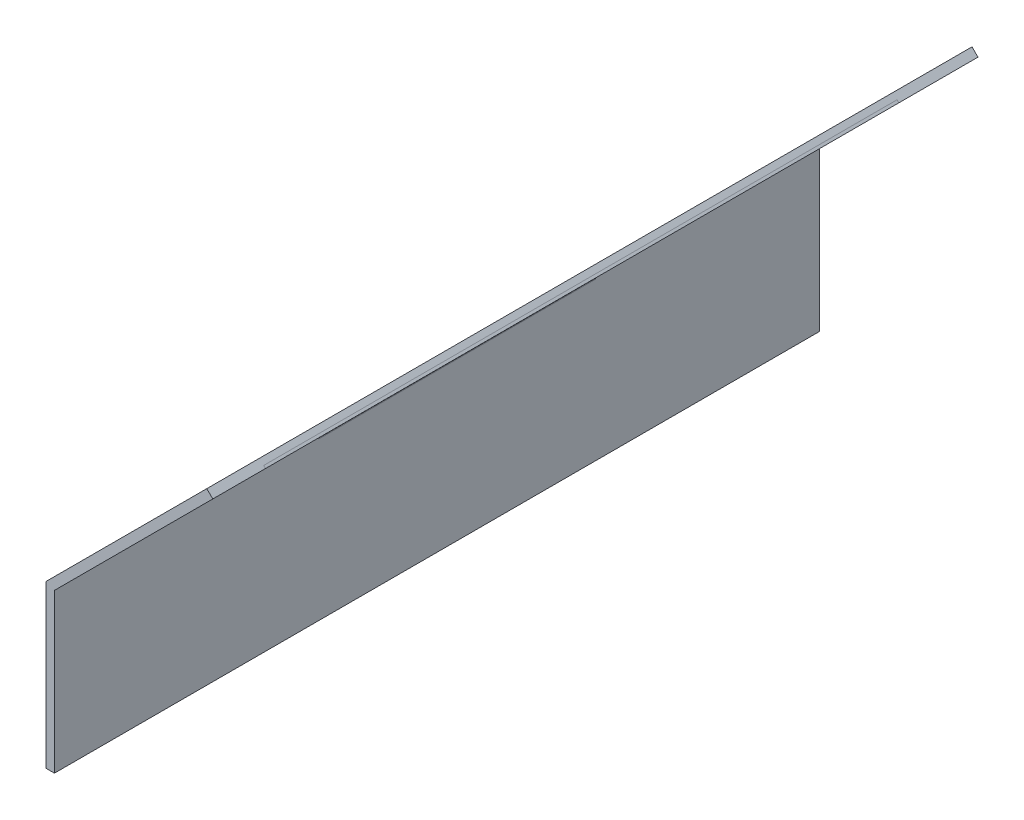
ISO-10303-21;
HEADER;
FILE_DESCRIPTION(('STEP AP214'),'2;1');
FILE_NAME('part.step','',(''),(''),'','','');
FILE_SCHEMA(('AUTOMOTIVE_DESIGN { 1 0 10303 214 1 1 1 1 }'));
ENDSEC;
DATA;
#1=APPLICATION_CONTEXT('core data for automotive mechanical design processes');
#2=APPLICATION_PROTOCOL_DEFINITION('international standard','automotive_design',2000,#1);
#3=PRODUCT_CONTEXT('',#1,'mechanical');
#4=PRODUCT('Part','Part','',(#3));
#5=PRODUCT_RELATED_PRODUCT_CATEGORY('part','',(#4));
#6=PRODUCT_DEFINITION_FORMATION('','',#4);
#7=PRODUCT_DEFINITION_CONTEXT('part definition',#1,'design');
#8=PRODUCT_DEFINITION('design','',#6,#7);
#9=PRODUCT_DEFINITION_SHAPE('','',#8);
#10=(LENGTH_UNIT() NAMED_UNIT(*) SI_UNIT(.MILLI.,.METRE.));
#11=(NAMED_UNIT(*) PLANE_ANGLE_UNIT() SI_UNIT($,.RADIAN.));
#12=(NAMED_UNIT(*) SI_UNIT($,.STERADIAN.) SOLID_ANGLE_UNIT());
#13=UNCERTAINTY_MEASURE_WITH_UNIT(LENGTH_MEASURE(1.E-05),#10,'distance_accuracy_value','');
#14=(GEOMETRIC_REPRESENTATION_CONTEXT(3) GLOBAL_UNCERTAINTY_ASSIGNED_CONTEXT((#13)) GLOBAL_UNIT_ASSIGNED_CONTEXT((#10,
#11,#12)) REPRESENTATION_CONTEXT('',''));
#15=CARTESIAN_POINT('',(0.,0.,0.));
#16=DIRECTION('',(0.,0.,1.));
#17=DIRECTION('',(1.,0.,0.));
#18=AXIS2_PLACEMENT_3D('',#15,#16,#17);
#19=CARTESIAN_POINT('',(5.334,75.6739487757862,-368.3));
#20=DIRECTION('',(0.,0.,-1.));
#21=DIRECTION('',(-1.,0.,0.));
#22=AXIS2_PLACEMENT_3D('',#19,#20,#21);
#23=CYLINDRICAL_SURFACE('',#22,2.48412);
#24=CARTESIAN_POINT('',(5.334,75.6739487757862,-25.3999999999999));
#25=DIRECTION('',(0.,0.,-1.));
#26=DIRECTION('',(0.,1.,0.));
#27=AXIS2_PLACEMENT_3D('',#24,#25,#26);
#28=CIRCLE('',#27,2.48412);
#29=CARTESIAN_POINT('',(3.57746190271888,77.4304868730673,-25.3999999999999));
#30=VERTEX_POINT('',#29);
#31=CARTESIAN_POINT('',(3.01788208970269,76.5719743878931,-25.3999999999999));
#32=VERTEX_POINT('',#31);
#33=EDGE_CURVE('E70',#30,#32,#28,.F.);
#34=ORIENTED_EDGE('',*,*,#33,.F.);
#35=DIRECTION('',(0.,0.,1.));
#36=VECTOR('',#35,1.);
#37=CARTESIAN_POINT('',(3.57746190271889,77.4304868730673,-368.3));
#38=LINE('',#37,#36);
#39=CARTESIAN_POINT('',(3.57746190271889,77.4304868730673,-330.2));
#40=VERTEX_POINT('',#39);
#41=EDGE_CURVE('E77',#30,#40,#38,.F.);
#42=ORIENTED_EDGE('',*,*,#41,.T.);
#43=CARTESIAN_POINT('',(5.334,75.6739487757862,-330.2));
#44=DIRECTION('',(0.,0.,1.));
#45=DIRECTION('',(1.,0.,0.));
#46=AXIS2_PLACEMENT_3D('',#43,#44,#45);
#47=CIRCLE('',#46,2.48412);
#48=CARTESIAN_POINT('',(3.01788208970269,76.5719743878931,-330.2));
#49=VERTEX_POINT('',#48);
#50=EDGE_CURVE('E189',#49,#40,#47,.F.);
#51=ORIENTED_EDGE('',*,*,#50,.F.);
#52=DIRECTION('',(0.,0.,-1.));
#53=VECTOR('',#52,1.);
#54=CARTESIAN_POINT('',(3.01788208970269,76.5719743878931,-368.3));
#55=LINE('',#54,#53);
#56=CARTESIAN_POINT('',(3.01788208970269,76.5719743878931,-260.35));
#57=VERTEX_POINT('',#56);
#58=EDGE_CURVE('E235',#57,#49,#55,.T.);
#59=ORIENTED_EDGE('',*,*,#58,.F.);
#60=CARTESIAN_POINT('',(5.334,75.6739487757862,-260.35));
#61=DIRECTION('',(0.,0.,1.));
#62=DIRECTION('',(1.,0.,0.));
#63=AXIS2_PLACEMENT_3D('',#60,#61,#62);
#64=CIRCLE('',#63,2.48412);
#65=CARTESIAN_POINT('',(2.84988,75.6739487757861,-260.35));
#66=VERTEX_POINT('',#65);
#67=EDGE_CURVE('E222',#66,#57,#64,.F.);
#68=ORIENTED_EDGE('',*,*,#67,.F.);
#69=DIRECTION('',(0.,0.,1.));
#70=VECTOR('',#69,1.);
#71=CARTESIAN_POINT('',(2.84988,75.6739487757861,-368.3));
#72=LINE('',#71,#70);
#73=CARTESIAN_POINT('',(2.84988,75.6739487757862,-127.));
#74=VERTEX_POINT('',#73);
#75=EDGE_CURVE('E161',#66,#74,#72,.T.);
#76=ORIENTED_EDGE('',*,*,#75,.T.);
#77=CARTESIAN_POINT('',(5.334,75.6739487757862,-127.));
#78=DIRECTION('',(0.,0.,-1.));
#79=DIRECTION('',(-1.,0.,0.));
#80=AXIS2_PLACEMENT_3D('',#77,#78,#79);
#81=CIRCLE('',#80,2.48412);
#82=CARTESIAN_POINT('',(3.01788208970269,76.5719743878931,-127.));
#83=VERTEX_POINT('',#82);
#84=EDGE_CURVE('E171',#83,#74,#81,.F.);
#85=ORIENTED_EDGE('',*,*,#84,.F.);
#86=DIRECTION('',(0.,0.,-1.));
#87=VECTOR('',#86,1.);
#88=CARTESIAN_POINT('',(3.01788208970269,76.5719743878931,-368.3));
#89=LINE('',#88,#87);
#90=EDGE_CURVE('E175',#83,#32,#89,.F.);
#91=ORIENTED_EDGE('',*,*,#90,.T.);
#92=EDGE_LOOP('',(#34,#42,#51,#59,#68,#76,#85,#91));
#93=FACE_BOUND('',#92,.T.);
#94=ADVANCED_FACE('F55',(#93),#23,.T.);
#95=CARTESIAN_POINT('',(4.06400000000001,0.,-368.3));
#96=DIRECTION('',(0.,1.,0.));
#97=DIRECTION('',(0.,0.,1.));
#98=AXIS2_PLACEMENT_3D('',#95,#96,#97);
#99=PLANE('',#98);
#100=DIRECTION('',(1.,0.,0.));
#101=VECTOR('',#100,1.);
#102=CARTESIAN_POINT('',(-139.7,0.,-260.35));
#103=LINE('',#102,#101);
#104=CARTESIAN_POINT('',(2.84988000000001,0.,-260.35));
#105=VERTEX_POINT('',#104);
#106=CARTESIAN_POINT('',(4.06400000000001,0.,-260.35));
#107=VERTEX_POINT('',#106);
#108=EDGE_CURVE('E218',#105,#107,#103,.T.);
#109=ORIENTED_EDGE('',*,*,#108,.T.);
#110=DIRECTION('',(0.,0.,1.));
#111=VECTOR('',#110,1.);
#112=CARTESIAN_POINT('',(4.06400000000001,0.,-368.3));
#113=LINE('',#112,#111);
#114=CARTESIAN_POINT('',(4.06400000000001,0.,-127.));
#115=VERTEX_POINT('',#114);
#116=EDGE_CURVE('E257',#107,#115,#113,.T.);
#117=ORIENTED_EDGE('',*,*,#116,.T.);
#118=DIRECTION('',(1.,0.,0.));
#119=VECTOR('',#118,1.);
#120=CARTESIAN_POINT('',(-139.7,0.,-127.));
#121=LINE('',#120,#119);
#122=CARTESIAN_POINT('',(2.84988,0.,-127.));
#123=VERTEX_POINT('',#122);
#124=EDGE_CURVE('E238',#123,#115,#121,.T.);
#125=ORIENTED_EDGE('',*,*,#124,.F.);
#126=DIRECTION('',(0.,0.,1.));
#127=VECTOR('',#126,1.);
#128=CARTESIAN_POINT('',(2.84988000000001,0.,-368.3));
#129=LINE('',#128,#127);
#130=EDGE_CURVE('E162',#105,#123,#129,.T.);
#131=ORIENTED_EDGE('',*,*,#130,.F.);
#132=EDGE_LOOP('',(#109,#117,#125,#131));
#133=FACE_BOUND('',#132,.T.);
#134=ADVANCED_FACE('F57',(#133),#99,.F.);
#135=CARTESIAN_POINT('',(80.2640000000003,152.4,-368.3));
#136=DIRECTION('',(0.707106781186549,0.707106781186546,0.));
#137=DIRECTION('',(0.,0.,1.));
#138=AXIS2_PLACEMENT_3D('',#135,#136,#137);
#139=PLANE('',#138);
#140=DIRECTION('',(-0.707106781186546,0.707106781186549,0.));
#141=VECTOR('',#140,1.);
#142=CARTESIAN_POINT('',(80.2640000000003,152.4,-25.3999999999999));
#143=LINE('',#142,#141);
#144=CARTESIAN_POINT('',(80.2640000000003,152.4,-25.3999999999999));
#145=VERTEX_POINT('',#144);
#146=CARTESIAN_POINT('',(79.4054875148261,153.258512485174,-25.3999999999999));
#147=VERTEX_POINT('',#146);
#148=EDGE_CURVE('E137',#145,#147,#143,.T.);
#149=ORIENTED_EDGE('',*,*,#148,.F.);
#150=DIRECTION('',(0.,0.,1.));
#151=VECTOR('',#150,1.);
#152=CARTESIAN_POINT('',(80.2640000000003,152.4,-368.3));
#153=LINE('',#152,#151);
#154=CARTESIAN_POINT('',(80.2640000000003,152.4,-330.2));
#155=VERTEX_POINT('',#154);
#156=EDGE_CURVE('E260',#155,#145,#153,.T.);
#157=ORIENTED_EDGE('',*,*,#156,.F.);
#158=DIRECTION('',(0.707106781186546,-0.707106781186549,0.));
#159=VECTOR('',#158,1.);
#160=CARTESIAN_POINT('',(80.2640000000003,152.4,-330.2));
#161=LINE('',#160,#159);
#162=CARTESIAN_POINT('',(79.4054875148261,153.258512485174,-330.2));
#163=VERTEX_POINT('',#162);
#164=EDGE_CURVE('E159',#163,#155,#161,.T.);
#165=ORIENTED_EDGE('',*,*,#164,.F.);
#166=DIRECTION('',(0.,0.,1.));
#167=VECTOR('',#166,1.);
#168=CARTESIAN_POINT('',(79.4054875148261,153.258512485174,-368.3));
#169=LINE('',#168,#167);
#170=EDGE_CURVE('E153',#163,#147,#169,.T.);
#171=ORIENTED_EDGE('',*,*,#170,.T.);
#172=EDGE_LOOP('',(#149,#157,#165,#171));
#173=FACE_BOUND('',#172,.T.);
#174=ADVANCED_FACE('F158',(#173),#139,.T.);
#175=CARTESIAN_POINT('',(4.064,76.2,-368.3));
#176=DIRECTION('',(0.707106781186546,-0.707106781186549,0.));
#177=DIRECTION('',(0.707106781186549,0.707106781186546,0.));
#178=AXIS2_PLACEMENT_3D('',#175,#176,#177);
#179=PLANE('',#178);
#180=DIRECTION('',(0.707106781186549,0.707106781186546,0.));
#181=VECTOR('',#180,1.);
#182=CARTESIAN_POINT('',(4.06399999999998,76.2,-25.3999999999999));
#183=LINE('',#182,#181);
#184=CARTESIAN_POINT('',(4.43597438789309,76.5719743878931,-25.3999999999999));
#185=VERTEX_POINT('',#184);
#186=EDGE_CURVE('E142',#185,#145,#183,.T.);
#187=ORIENTED_EDGE('',*,*,#186,.F.);
#188=DIRECTION('',(0.,0.,1.));
#189=VECTOR('',#188,1.);
#190=CARTESIAN_POINT('',(4.43597438789309,76.5719743878931,-368.3));
#191=LINE('',#190,#189);
#192=CARTESIAN_POINT('',(4.43597438789308,76.5719743878931,-127.));
#193=VERTEX_POINT('',#192);
#194=EDGE_CURVE('E176',#185,#193,#191,.F.);
#195=ORIENTED_EDGE('',*,*,#194,.T.);
#196=CARTESIAN_POINT('',(4.43597438789309,76.5719743878931,-260.35));
#197=VERTEX_POINT('',#196);
#198=EDGE_CURVE('E268',#193,#197,#191,.F.);
#199=ORIENTED_EDGE('',*,*,#198,.T.);
#200=CARTESIAN_POINT('',(4.43597438789308,76.5719743878931,-330.2));
#201=VERTEX_POINT('',#200);
#202=EDGE_CURVE('E266',#197,#201,#191,.F.);
#203=ORIENTED_EDGE('',*,*,#202,.T.);
#204=DIRECTION('',(-0.707106781186549,-0.707106781186546,0.));
#205=VECTOR('',#204,1.);
#206=CARTESIAN_POINT('',(4.064,76.2,-330.2));
#207=LINE('',#206,#205);
#208=EDGE_CURVE('E193',#155,#201,#207,.T.);
#209=ORIENTED_EDGE('',*,*,#208,.F.);
#210=ORIENTED_EDGE('',*,*,#156,.T.);
#211=EDGE_LOOP('',(#187,#195,#199,#203,#209,#210));
#212=FACE_BOUND('',#211,.T.);
#213=ADVANCED_FACE('F275',(#212),#179,.T.);
#214=CARTESIAN_POINT('',(4.06400000000001,0.,-368.3));
#215=DIRECTION('',(1.,0.,0.));
#216=DIRECTION('',(0.,1.,0.));
#217=AXIS2_PLACEMENT_3D('',#214,#215,#216);
#218=PLANE('',#217);
#219=CARTESIAN_POINT('',(4.06400000000001,12.7,-247.65));
#220=DIRECTION('',(1.,0.,0.));
#221=DIRECTION('',(0.,1.,0.));
#222=AXIS2_PLACEMENT_3D('',#219,#220,#221);
#223=CIRCLE('',#222,3.26389999999998);
#224=CARTESIAN_POINT('',(4.06400000000001,15.9639,-247.65));
#225=VERTEX_POINT('',#224);
#226=EDGE_CURVE('E213',#225,#225,#223,.T.);
#227=ORIENTED_EDGE('',*,*,#226,.F.);
#228=EDGE_LOOP('',(#227));
#229=FACE_BOUND('',#228,.T.);
#230=CARTESIAN_POINT('',(4.06400000000001,12.7,-139.7));
#231=DIRECTION('',(1.,0.,0.));
#232=DIRECTION('',(0.,1.,0.));
#233=AXIS2_PLACEMENT_3D('',#230,#231,#232);
#234=CIRCLE('',#233,3.26389999999998);
#235=CARTESIAN_POINT('',(4.06400000000001,15.9639,-139.7));
#236=VERTEX_POINT('',#235);
#237=EDGE_CURVE('E206',#236,#236,#234,.T.);
#238=ORIENTED_EDGE('',*,*,#237,.F.);
#239=EDGE_LOOP('',(#238));
#240=FACE_BOUND('',#239,.T.);
#241=DIRECTION('',(0.,-1.,0.));
#242=VECTOR('',#241,1.);
#243=CARTESIAN_POINT('',(4.06400000000001,0.,-260.35));
#244=LINE('',#243,#242);
#245=CARTESIAN_POINT('',(4.064,75.6739487757862,-260.35));
#246=VERTEX_POINT('',#245);
#247=EDGE_CURVE('E232',#246,#107,#244,.T.);
#248=ORIENTED_EDGE('',*,*,#247,.F.);
#249=DIRECTION('',(0.,0.,1.));
#250=VECTOR('',#249,1.);
#251=CARTESIAN_POINT('',(4.064,75.6739487757862,0.));
#252=LINE('',#251,#250);
#253=CARTESIAN_POINT('',(4.064,75.6739487757862,-127.));
#254=VERTEX_POINT('',#253);
#255=EDGE_CURVE('E263',#246,#254,#252,.T.);
#256=ORIENTED_EDGE('',*,*,#255,.T.);
#257=DIRECTION('',(0.,1.,0.));
#258=VECTOR('',#257,1.);
#259=CARTESIAN_POINT('',(4.06400000000001,0.,-127.));
#260=LINE('',#259,#258);
#261=EDGE_CURVE('E167',#115,#254,#260,.T.);
#262=ORIENTED_EDGE('',*,*,#261,.F.);
#263=ORIENTED_EDGE('',*,*,#116,.F.);
#264=EDGE_LOOP('',(#248,#256,#262,#263));
#265=FACE_BOUND('',#264,.T.);
#266=ADVANCED_FACE('F287',(#229,#240,#265),#218,.T.);
#267=CARTESIAN_POINT('',(5.334,75.6739487757862,-368.3));
#268=DIRECTION('',(0.,0.,-1.));
#269=DIRECTION('',(-1.,0.,0.));
#270=AXIS2_PLACEMENT_3D('',#267,#268,#269);
#271=CYLINDRICAL_SURFACE('',#270,1.27);
#272=ORIENTED_EDGE('',*,*,#255,.F.);
#273=CARTESIAN_POINT('',(5.334,75.6739487757862,-260.35));
#274=DIRECTION('',(0.,0.,1.));
#275=DIRECTION('',(1.,0.,0.));
#276=AXIS2_PLACEMENT_3D('',#273,#274,#275);
#277=CIRCLE('',#276,1.27);
#278=EDGE_CURVE('E228',#246,#197,#277,.F.);
#279=ORIENTED_EDGE('',*,*,#278,.T.);
#280=ORIENTED_EDGE('',*,*,#198,.F.);
#281=CARTESIAN_POINT('',(5.334,75.6739487757862,-127.));
#282=DIRECTION('',(0.,0.,-1.));
#283=DIRECTION('',(-1.,0.,0.));
#284=AXIS2_PLACEMENT_3D('',#281,#282,#283);
#285=CIRCLE('',#284,1.27);
#286=EDGE_CURVE('E250',#193,#254,#285,.F.);
#287=ORIENTED_EDGE('',*,*,#286,.T.);
#288=EDGE_LOOP('',(#272,#279,#280,#287));
#289=FACE_BOUND('',#288,.T.);
#290=ADVANCED_FACE('F280',(#289),#271,.F.);
#291=CARTESIAN_POINT('',(3.20548751482579,77.0585124851742,-368.3));
#292=DIRECTION('',(0.707106781186546,-0.707106781186549,0.));
#293=DIRECTION('',(0.707106781186549,0.707106781186546,0.));
#294=AXIS2_PLACEMENT_3D('',#291,#292,#293);
#295=PLANE('',#294);
#296=ORIENTED_EDGE('',*,*,#41,.F.);
#297=DIRECTION('',(0.707106781186549,0.707106781186546,0.));
#298=VECTOR('',#297,1.);
#299=CARTESIAN_POINT('',(3.20548751482578,77.0585124851742,-25.3999999999999));
#300=LINE('',#299,#298);
#301=EDGE_CURVE('E140',#30,#147,#300,.T.);
#302=ORIENTED_EDGE('',*,*,#301,.T.);
#303=ORIENTED_EDGE('',*,*,#170,.F.);
#304=DIRECTION('',(-0.707106781186549,-0.707106781186546,0.));
#305=VECTOR('',#304,1.);
#306=CARTESIAN_POINT('',(3.20548751482579,77.0585124851742,-330.2));
#307=LINE('',#306,#305);
#308=EDGE_CURVE('E64',#163,#40,#307,.T.);
#309=ORIENTED_EDGE('',*,*,#308,.T.);
#310=EDGE_LOOP('',(#296,#302,#303,#309));
#311=FACE_BOUND('',#310,.T.);
#312=ADVANCED_FACE('F151',(#311),#295,.F.);
#313=CARTESIAN_POINT('',(2.84988000000001,0.,-368.3));
#314=DIRECTION('',(1.,0.,0.));
#315=DIRECTION('',(0.,1.,0.));
#316=AXIS2_PLACEMENT_3D('',#313,#314,#315);
#317=PLANE('',#316);
#318=CARTESIAN_POINT('',(2.84988000000001,12.7,-247.65));
#319=DIRECTION('',(-1.,0.,0.));
#320=DIRECTION('',(0.,-1.,0.));
#321=AXIS2_PLACEMENT_3D('',#318,#319,#320);
#322=CIRCLE('',#321,3.26389999999998);
#323=CARTESIAN_POINT('',(2.84988000000001,9.43610000000002,-247.65));
#324=VERTEX_POINT('',#323);
#325=EDGE_CURVE('E202',#324,#324,#322,.T.);
#326=ORIENTED_EDGE('',*,*,#325,.F.);
#327=EDGE_LOOP('',(#326));
#328=FACE_BOUND('',#327,.T.);
#329=CARTESIAN_POINT('',(2.84988000000001,12.7,-139.7));
#330=DIRECTION('',(-1.,0.,0.));
#331=DIRECTION('',(0.,-1.,0.));
#332=AXIS2_PLACEMENT_3D('',#329,#330,#331);
#333=CIRCLE('',#332,3.26389999999998);
#334=CARTESIAN_POINT('',(2.84988000000001,9.43610000000002,-139.7));
#335=VERTEX_POINT('',#334);
#336=EDGE_CURVE('E197',#335,#335,#333,.T.);
#337=ORIENTED_EDGE('',*,*,#336,.F.);
#338=EDGE_LOOP('',(#337));
#339=FACE_BOUND('',#338,.T.);
#340=ORIENTED_EDGE('',*,*,#75,.F.);
#341=DIRECTION('',(0.,-1.,0.));
#342=VECTOR('',#341,1.);
#343=CARTESIAN_POINT('',(2.84988000000001,0.,-260.35));
#344=LINE('',#343,#342);
#345=EDGE_CURVE('E180',#66,#105,#344,.T.);
#346=ORIENTED_EDGE('',*,*,#345,.T.);
#347=ORIENTED_EDGE('',*,*,#130,.T.);
#348=DIRECTION('',(0.,1.,0.));
#349=VECTOR('',#348,1.);
#350=CARTESIAN_POINT('',(2.84988000000001,0.,-127.));
#351=LINE('',#350,#349);
#352=EDGE_CURVE('E246',#123,#74,#351,.T.);
#353=ORIENTED_EDGE('',*,*,#352,.T.);
#354=EDGE_LOOP('',(#340,#346,#347,#353));
#355=FACE_BOUND('',#354,.T.);
#356=ADVANCED_FACE('F298',(#328,#339,#355),#317,.F.);
#357=CARTESIAN_POINT('',(-139.7,76.5719743878931,0.));
#358=DIRECTION('',(0.,-1.,0.));
#359=DIRECTION('',(0.,0.,-1.));
#360=AXIS2_PLACEMENT_3D('',#357,#358,#359);
#361=PLANE('',#360);
#362=DIRECTION('',(1.,0.,0.));
#363=VECTOR('',#362,1.);
#364=CARTESIAN_POINT('',(-139.7,76.5719743878931,-25.3999999999999));
#365=LINE('',#364,#363);
#366=EDGE_CURVE('E12',#32,#185,#365,.T.);
#367=ORIENTED_EDGE('',*,*,#366,.F.);
#368=ORIENTED_EDGE('',*,*,#90,.F.);
#369=DIRECTION('',(1.,0.,0.));
#370=VECTOR('',#369,1.);
#371=CARTESIAN_POINT('',(-139.7,76.5719743878931,-127.));
#372=LINE('',#371,#370);
#373=EDGE_CURVE('E242',#83,#193,#372,.T.);
#374=ORIENTED_EDGE('',*,*,#373,.T.);
#375=ORIENTED_EDGE('',*,*,#194,.F.);
#376=EDGE_LOOP('',(#367,#368,#374,#375));
#377=FACE_BOUND('',#376,.T.);
#378=ADVANCED_FACE('F306',(#377),#361,.T.);
#379=CARTESIAN_POINT('',(-139.7,0.,-127.));
#380=DIRECTION('',(0.,0.,-1.));
#381=DIRECTION('',(-1.,0.,0.));
#382=AXIS2_PLACEMENT_3D('',#379,#380,#381);
#383=PLANE('',#382);
#384=ORIENTED_EDGE('',*,*,#261,.T.);
#385=ORIENTED_EDGE('',*,*,#286,.F.);
#386=ORIENTED_EDGE('',*,*,#373,.F.);
#387=ORIENTED_EDGE('',*,*,#84,.T.);
#388=ORIENTED_EDGE('',*,*,#352,.F.);
#389=ORIENTED_EDGE('',*,*,#124,.T.);
#390=EDGE_LOOP('',(#384,#385,#386,#387,#388,#389));
#391=FACE_BOUND('',#390,.T.);
#392=ADVANCED_FACE('F294',(#391),#383,.F.);
#393=CARTESIAN_POINT('',(-139.7,76.5719743878931,-292.1));
#394=DIRECTION('',(0.,1.,0.));
#395=DIRECTION('',(0.,0.,1.));
#396=AXIS2_PLACEMENT_3D('',#393,#394,#395);
#397=PLANE('',#396);
#398=ORIENTED_EDGE('',*,*,#58,.T.);
#399=DIRECTION('',(1.,0.,0.));
#400=VECTOR('',#399,1.);
#401=CARTESIAN_POINT('',(0.,76.5719743878931,-330.2));
#402=LINE('',#401,#400);
#403=EDGE_CURVE('E155',#49,#201,#402,.T.);
#404=ORIENTED_EDGE('',*,*,#403,.T.);
#405=ORIENTED_EDGE('',*,*,#202,.F.);
#406=DIRECTION('',(1.,0.,0.));
#407=VECTOR('',#406,1.);
#408=CARTESIAN_POINT('',(-139.7,76.5719743878931,-260.35));
#409=LINE('',#408,#407);
#410=EDGE_CURVE('E217',#57,#197,#409,.T.);
#411=ORIENTED_EDGE('',*,*,#410,.F.);
#412=EDGE_LOOP('',(#398,#404,#405,#411));
#413=FACE_BOUND('',#412,.T.);
#414=ADVANCED_FACE('F301',(#413),#397,.F.);
#415=CARTESIAN_POINT('',(-139.7,0.,-260.35));
#416=DIRECTION('',(0.,0.,1.));
#417=DIRECTION('',(1.,0.,0.));
#418=AXIS2_PLACEMENT_3D('',#415,#416,#417);
#419=PLANE('',#418);
#420=ORIENTED_EDGE('',*,*,#247,.T.);
#421=ORIENTED_EDGE('',*,*,#108,.F.);
#422=ORIENTED_EDGE('',*,*,#345,.F.);
#423=ORIENTED_EDGE('',*,*,#67,.T.);
#424=ORIENTED_EDGE('',*,*,#410,.T.);
#425=ORIENTED_EDGE('',*,*,#278,.F.);
#426=EDGE_LOOP('',(#420,#421,#422,#423,#424,#425));
#427=FACE_BOUND('',#426,.T.);
#428=ADVANCED_FACE('F283',(#427),#419,.F.);
#429=CARTESIAN_POINT('',(294.94988,12.7,-139.7));
#430=DIRECTION('',(-1.,0.,0.));
#431=DIRECTION('',(0.,-1.,0.));
#432=AXIS2_PLACEMENT_3D('',#429,#430,#431);
#433=CYLINDRICAL_SURFACE('',#432,3.26389999999998);
#434=ORIENTED_EDGE('',*,*,#237,.T.);
#435=EDGE_LOOP('',(#434));
#436=FACE_BOUND('',#435,.T.);
#437=ORIENTED_EDGE('',*,*,#336,.T.);
#438=EDGE_LOOP('',(#437));
#439=FACE_BOUND('',#438,.T.);
#440=ADVANCED_FACE('F357',(#436,#439),#433,.F.);
#441=CARTESIAN_POINT('',(294.94988,12.7,-247.65));
#442=DIRECTION('',(-1.,0.,0.));
#443=DIRECTION('',(0.,-1.,0.));
#444=AXIS2_PLACEMENT_3D('',#441,#442,#443);
#445=CYLINDRICAL_SURFACE('',#444,3.26389999999998);
#446=ORIENTED_EDGE('',*,*,#226,.T.);
#447=EDGE_LOOP('',(#446));
#448=FACE_BOUND('',#447,.T.);
#449=ORIENTED_EDGE('',*,*,#325,.T.);
#450=EDGE_LOOP('',(#449));
#451=FACE_BOUND('',#450,.T.);
#452=ADVANCED_FACE('F362',(#448,#451),#445,.F.);
#453=CARTESIAN_POINT('',(0.,76.5719743878931,-330.2));
#454=DIRECTION('',(0.,0.,1.));
#455=DIRECTION('',(1.,0.,0.));
#456=AXIS2_PLACEMENT_3D('',#453,#454,#455);
#457=PLANE('',#456);
#458=ORIENTED_EDGE('',*,*,#208,.T.);
#459=ORIENTED_EDGE('',*,*,#403,.F.);
#460=ORIENTED_EDGE('',*,*,#50,.T.);
#461=ORIENTED_EDGE('',*,*,#308,.F.);
#462=ORIENTED_EDGE('',*,*,#164,.T.);
#463=EDGE_LOOP('',(#458,#459,#460,#461,#462));
#464=FACE_BOUND('',#463,.T.);
#465=ADVANCED_FACE('F186',(#464),#457,.F.);
#466=CARTESIAN_POINT('',(0.,153.258512485174,-25.3999999999999));
#467=DIRECTION('',(0.,0.,-1.));
#468=DIRECTION('',(0.,1.,0.));
#469=AXIS2_PLACEMENT_3D('',#466,#467,#468);
#470=PLANE('',#469);
#471=ORIENTED_EDGE('',*,*,#33,.T.);
#472=ORIENTED_EDGE('',*,*,#366,.T.);
#473=ORIENTED_EDGE('',*,*,#186,.T.);
#474=ORIENTED_EDGE('',*,*,#148,.T.);
#475=ORIENTED_EDGE('',*,*,#301,.F.);
#476=EDGE_LOOP('',(#471,#472,#473,#474,#475));
#477=FACE_BOUND('',#476,.T.);
#478=ADVANCED_FACE('F139',(#477),#470,.F.);
#479=CLOSED_SHELL('',(#94,#134,#174,#213,#266,#290,#312,#356,#378,#392,#414,#428,#440,#452,#465,#478));
#480=MANIFOLD_SOLID_BREP('B2',#479);
#481=CARTESIAN_POINT('',(0.,77.8833639174843,-368.3));
#482=DIRECTION('',(-1.,0.,0.));
#483=DIRECTION('',(0.,0.,1.));
#484=AXIS2_PLACEMENT_3D('',#481,#482,#483);
#485=PLANE('',#484);
#486=DIRECTION('',(0.,-1.,0.));
#487=VECTOR('',#486,1.);
#488=CARTESIAN_POINT('',(0.,77.8833639174843,0.));
#489=LINE('',#488,#487);
#490=CARTESIAN_POINT('',(0.,77.8833639174843,0.));
#491=VERTEX_POINT('',#490);
#492=CARTESIAN_POINT('',(0.,0.,0.));
#493=VERTEX_POINT('',#492);
#494=EDGE_CURVE('E566',#491,#493,#489,.T.);
#495=ORIENTED_EDGE('',*,*,#494,.F.);
#496=DIRECTION('',(0.,0.,1.));
#497=VECTOR('',#496,1.);
#498=CARTESIAN_POINT('',(0.,77.8833639174843,-368.3));
#499=LINE('',#498,#497);
#500=CARTESIAN_POINT('',(0.,77.8833639174843,-368.3));
#501=VERTEX_POINT('',#500);
#502=EDGE_CURVE('E53',#501,#491,#499,.T.);
#503=ORIENTED_EDGE('',*,*,#502,.F.);
#504=DIRECTION('',(0.,-1.,0.));
#505=VECTOR('',#504,1.);
#506=CARTESIAN_POINT('',(0.,77.8833639174843,-368.3));
#507=LINE('',#506,#505);
#508=CARTESIAN_POINT('',(0.,0.,-368.3));
#509=VERTEX_POINT('',#508);
#510=EDGE_CURVE('E579',#501,#509,#507,.T.);
#511=ORIENTED_EDGE('',*,*,#510,.T.);
#512=DIRECTION('',(0.,0.,1.));
#513=VECTOR('',#512,1.);
#514=CARTESIAN_POINT('',(0.,0.,-368.3));
#515=LINE('',#514,#513);
#516=EDGE_CURVE('E480',#509,#493,#515,.T.);
#517=ORIENTED_EDGE('',*,*,#516,.T.);
#518=EDGE_LOOP('',(#495,#503,#511,#517));
#519=FACE_BOUND('',#518,.T.);
#520=ADVANCED_FACE('F477',(#519),#485,.T.);
#521=CARTESIAN_POINT('',(0.,77.8833639174843,-368.3));
#522=DIRECTION('',(-0.707106781186547,0.707106781186548,0.));
#523=DIRECTION('',(-0.707106781186548,-0.707106781186547,0.));
#524=AXIS2_PLACEMENT_3D('',#521,#522,#523);
#525=PLANE('',#524);
#526=DIRECTION('',(-0.707106781186548,-0.707106781186547,0.));
#527=VECTOR('',#526,1.);
#528=CARTESIAN_POINT('',(0.,77.8833639174843,0.));
#529=LINE('',#528,#527);
#530=CARTESIAN_POINT('',(77.3903180412582,155.273681958742,0.));
#531=VERTEX_POINT('',#530);
#532=EDGE_CURVE('E514',#531,#491,#529,.T.);
#533=ORIENTED_EDGE('',*,*,#532,.F.);
#534=DIRECTION('',(0.,0.,1.));
#535=VECTOR('',#534,1.);
#536=CARTESIAN_POINT('',(77.3903180412582,155.273681958742,-368.3));
#537=LINE('',#536,#535);
#538=CARTESIAN_POINT('',(77.3903180412582,155.273681958742,-368.3));
#539=VERTEX_POINT('',#538);
#540=EDGE_CURVE('E486',#539,#531,#537,.T.);
#541=ORIENTED_EDGE('',*,*,#540,.F.);
#542=DIRECTION('',(-0.707106781187276,-0.707106781185819,0.));
#543=VECTOR('',#542,1.);
#544=CARTESIAN_POINT('',(77.3903180412582,155.273681958742,-368.3));
#545=LINE('',#544,#543);
#546=EDGE_CURVE('E494',#539,#501,#545,.T.);
#547=ORIENTED_EDGE('',*,*,#546,.T.);
#548=ORIENTED_EDGE('',*,*,#502,.T.);
#549=EDGE_LOOP('',(#533,#541,#547,#548));
#550=FACE_BOUND('',#549,.T.);
#551=ADVANCED_FACE('F601',(#550),#525,.T.);
#552=CARTESIAN_POINT('',(80.2640000000003,152.4,-368.3));
#553=DIRECTION('',(0.707106781186551,0.707106781186544,0.));
#554=DIRECTION('',(-0.707106781186544,0.707106781186551,0.));
#555=AXIS2_PLACEMENT_3D('',#552,#553,#554);
#556=PLANE('',#555);
#557=DIRECTION('',(-0.707106781186544,0.707106781186551,0.));
#558=VECTOR('',#557,1.);
#559=CARTESIAN_POINT('',(80.2640000000003,152.4,0.));
#560=LINE('',#559,#558);
#561=CARTESIAN_POINT('',(80.2640000000003,152.4,0.));
#562=VERTEX_POINT('',#561);
#563=EDGE_CURVE('E539',#562,#531,#560,.T.);
#564=ORIENTED_EDGE('',*,*,#563,.F.);
#565=DIRECTION('',(0.,0.,1.));
#566=VECTOR('',#565,1.);
#567=CARTESIAN_POINT('',(80.2640000000003,152.4,-368.3));
#568=LINE('',#567,#566);
#569=CARTESIAN_POINT('',(80.2640000000003,152.4,-368.3));
#570=VERTEX_POINT('',#569);
#571=EDGE_CURVE('E534',#570,#562,#568,.T.);
#572=ORIENTED_EDGE('',*,*,#571,.F.);
#573=DIRECTION('',(-0.707106781186544,0.707106781186551,0.));
#574=VECTOR('',#573,1.);
#575=CARTESIAN_POINT('',(80.2640000000003,152.4,-368.3));
#576=LINE('',#575,#574);
#577=EDGE_CURVE('E537',#570,#539,#576,.T.);
#578=ORIENTED_EDGE('',*,*,#577,.T.);
#579=ORIENTED_EDGE('',*,*,#540,.T.);
#580=EDGE_LOOP('',(#564,#572,#578,#579));
#581=FACE_BOUND('',#580,.T.);
#582=ADVANCED_FACE('F536',(#581),#556,.T.);
#583=CARTESIAN_POINT('',(4.064,76.2,-368.3));
#584=DIRECTION('',(0.707106781186546,-0.707106781186549,0.));
#585=DIRECTION('',(0.707106781186549,0.707106781186546,0.));
#586=AXIS2_PLACEMENT_3D('',#583,#584,#585);
#587=PLANE('',#586);
#588=DIRECTION('',(0.707106781186549,0.707106781186546,0.));
#589=VECTOR('',#588,1.);
#590=CARTESIAN_POINT('',(4.064,76.2,0.));
#591=LINE('',#590,#589);
#592=CARTESIAN_POINT('',(4.064,76.2,0.));
#593=VERTEX_POINT('',#592);
#594=EDGE_CURVE('E576',#593,#562,#591,.T.);
#595=ORIENTED_EDGE('',*,*,#594,.F.);
#596=DIRECTION('',(0.,0.,1.));
#597=VECTOR('',#596,1.);
#598=CARTESIAN_POINT('',(4.064,76.2,-368.3));
#599=LINE('',#598,#597);
#600=CARTESIAN_POINT('',(4.064,76.2,-368.3));
#601=VERTEX_POINT('',#600);
#602=EDGE_CURVE('E545',#601,#593,#599,.T.);
#603=ORIENTED_EDGE('',*,*,#602,.F.);
#604=DIRECTION('',(0.707106781186549,0.707106781186546,0.));
#605=VECTOR('',#604,1.);
#606=CARTESIAN_POINT('',(4.064,76.2,-368.3));
#607=LINE('',#606,#605);
#608=EDGE_CURVE('E552',#601,#570,#607,.T.);
#609=ORIENTED_EDGE('',*,*,#608,.T.);
#610=ORIENTED_EDGE('',*,*,#571,.T.);
#611=EDGE_LOOP('',(#595,#603,#609,#610));
#612=FACE_BOUND('',#611,.T.);
#613=ADVANCED_FACE('F555',(#612),#587,.T.);
#614=CARTESIAN_POINT('',(4.06400000000001,0.,-368.3));
#615=DIRECTION('',(1.,0.,0.));
#616=DIRECTION('',(0.,1.,0.));
#617=AXIS2_PLACEMENT_3D('',#614,#615,#616);
#618=PLANE('',#617);
#619=DIRECTION('',(0.,1.,0.));
#620=VECTOR('',#619,1.);
#621=CARTESIAN_POINT('',(4.06400000000001,0.,0.));
#622=LINE('',#621,#620);
#623=CARTESIAN_POINT('',(4.06400000000001,0.,0.));
#624=VERTEX_POINT('',#623);
#625=EDGE_CURVE('E572',#624,#593,#622,.T.);
#626=ORIENTED_EDGE('',*,*,#625,.F.);
#627=DIRECTION('',(0.,0.,1.));
#628=VECTOR('',#627,1.);
#629=CARTESIAN_POINT('',(4.06400000000001,0.,-368.3));
#630=LINE('',#629,#628);
#631=CARTESIAN_POINT('',(4.06400000000001,0.,-368.3));
#632=VERTEX_POINT('',#631);
#633=EDGE_CURVE('E582',#632,#624,#630,.T.);
#634=ORIENTED_EDGE('',*,*,#633,.F.);
#635=DIRECTION('',(0.,1.,0.));
#636=VECTOR('',#635,1.);
#637=CARTESIAN_POINT('',(4.06400000000001,0.,-368.3));
#638=LINE('',#637,#636);
#639=EDGE_CURVE('E557',#632,#601,#638,.T.);
#640=ORIENTED_EDGE('',*,*,#639,.T.);
#641=ORIENTED_EDGE('',*,*,#602,.T.);
#642=EDGE_LOOP('',(#626,#634,#640,#641));
#643=FACE_BOUND('',#642,.T.);
#644=ADVANCED_FACE('F591',(#643),#618,.T.);
#645=CARTESIAN_POINT('',(0.,0.,-368.3));
#646=DIRECTION('',(0.,-1.,0.));
#647=DIRECTION('',(0.,0.,-1.));
#648=AXIS2_PLACEMENT_3D('',#645,#646,#647);
#649=PLANE('',#648);
#650=DIRECTION('',(1.,0.,0.));
#651=VECTOR('',#650,1.);
#652=CARTESIAN_POINT('',(0.,0.,0.));
#653=LINE('',#652,#651);
#654=EDGE_CURVE('E569',#493,#624,#653,.T.);
#655=ORIENTED_EDGE('',*,*,#654,.F.);
#656=ORIENTED_EDGE('',*,*,#516,.F.);
#657=DIRECTION('',(1.,0.,0.));
#658=VECTOR('',#657,1.);
#659=CARTESIAN_POINT('',(0.,0.,-368.3));
#660=LINE('',#659,#658);
#661=EDGE_CURVE('E561',#509,#632,#660,.T.);
#662=ORIENTED_EDGE('',*,*,#661,.T.);
#663=ORIENTED_EDGE('',*,*,#633,.T.);
#664=EDGE_LOOP('',(#655,#656,#662,#663));
#665=FACE_BOUND('',#664,.T.);
#666=ADVANCED_FACE('F587',(#665),#649,.T.);
#667=CARTESIAN_POINT('',(0.,0.,-368.3));
#668=DIRECTION('',(0.,0.,1.));
#669=DIRECTION('',(1.,0.,0.));
#670=AXIS2_PLACEMENT_3D('',#667,#668,#669);
#671=PLANE('',#670);
#672=ORIENTED_EDGE('',*,*,#510,.F.);
#673=ORIENTED_EDGE('',*,*,#546,.F.);
#674=ORIENTED_EDGE('',*,*,#577,.F.);
#675=ORIENTED_EDGE('',*,*,#608,.F.);
#676=ORIENTED_EDGE('',*,*,#639,.F.);
#677=ORIENTED_EDGE('',*,*,#661,.F.);
#678=EDGE_LOOP('',(#672,#673,#674,#675,#676,#677));
#679=FACE_BOUND('',#678,.T.);
#680=ADVANCED_FACE('F550',(#679),#671,.F.);
#681=CARTESIAN_POINT('',(0.,0.,0.));
#682=DIRECTION('',(0.,0.,1.));
#683=DIRECTION('',(1.,0.,0.));
#684=AXIS2_PLACEMENT_3D('',#681,#682,#683);
#685=PLANE('',#684);
#686=ORIENTED_EDGE('',*,*,#494,.T.);
#687=ORIENTED_EDGE('',*,*,#654,.T.);
#688=ORIENTED_EDGE('',*,*,#625,.T.);
#689=ORIENTED_EDGE('',*,*,#594,.T.);
#690=ORIENTED_EDGE('',*,*,#563,.T.);
#691=ORIENTED_EDGE('',*,*,#532,.T.);
#692=EDGE_LOOP('',(#686,#687,#688,#689,#690,#691));
#693=FACE_BOUND('',#692,.T.);
#694=ADVANCED_FACE('F589',(#693),#685,.T.);
#695=CLOSED_SHELL('',(#520,#551,#582,#613,#644,#666,#680,#694));
#696=MANIFOLD_SOLID_BREP('B6_NOT_SHOWN',#695);
#697=ADVANCED_BREP_SHAPE_REPRESENTATION('',(#18,#480,#696),#14);
#698=SHAPE_DEFINITION_REPRESENTATION(#9,#697);
ENDSEC;
END-ISO-10303-21;
